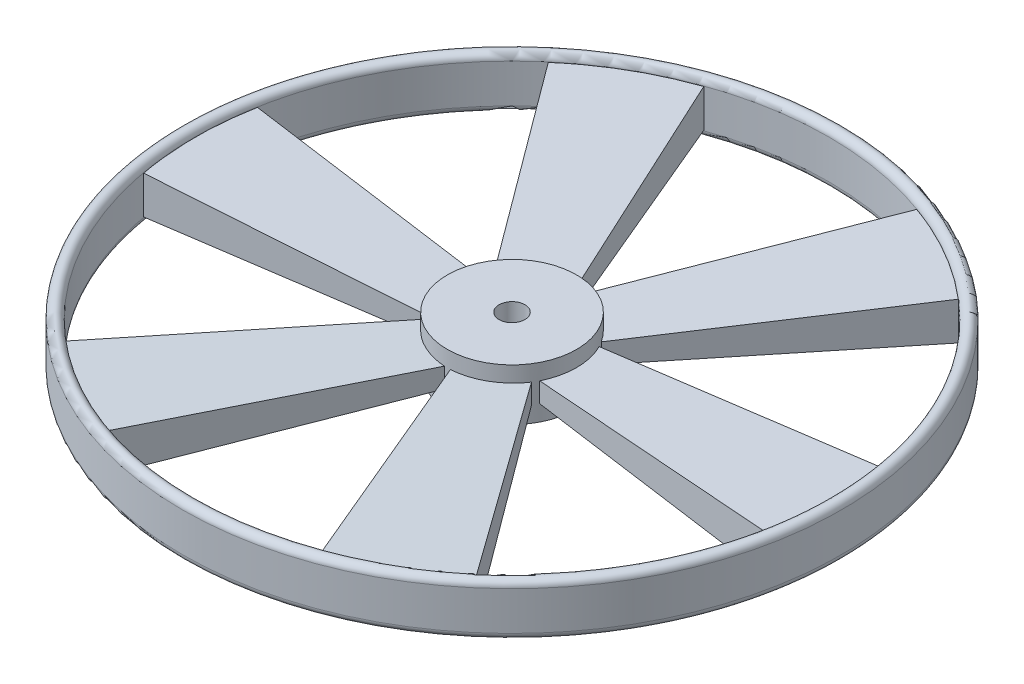
ISO-10303-21;
HEADER;
FILE_DESCRIPTION(('STEP AP214'),'2;1');
FILE_NAME('part.step','',(''),(''),'','','');
FILE_SCHEMA(('AUTOMOTIVE_DESIGN { 1 0 10303 214 1 1 1 1 }'));
ENDSEC;
DATA;
#1=APPLICATION_CONTEXT('core data for automotive mechanical design processes');
#2=APPLICATION_PROTOCOL_DEFINITION('international standard','automotive_design',2000,#1);
#3=PRODUCT_CONTEXT('',#1,'mechanical');
#4=PRODUCT('Part','Part','',(#3));
#5=PRODUCT_RELATED_PRODUCT_CATEGORY('part','',(#4));
#6=PRODUCT_DEFINITION_FORMATION('','',#4);
#7=PRODUCT_DEFINITION_CONTEXT('part definition',#1,'design');
#8=PRODUCT_DEFINITION('design','',#6,#7);
#9=PRODUCT_DEFINITION_SHAPE('','',#8);
#10=(LENGTH_UNIT() NAMED_UNIT(*) SI_UNIT(.MILLI.,.METRE.));
#11=(NAMED_UNIT(*) PLANE_ANGLE_UNIT() SI_UNIT($,.RADIAN.));
#12=(NAMED_UNIT(*) SI_UNIT($,.STERADIAN.) SOLID_ANGLE_UNIT());
#13=UNCERTAINTY_MEASURE_WITH_UNIT(LENGTH_MEASURE(1.E-05),#10,'distance_accuracy_value','');
#14=(GEOMETRIC_REPRESENTATION_CONTEXT(3) GLOBAL_UNCERTAINTY_ASSIGNED_CONTEXT((#13)) GLOBAL_UNIT_ASSIGNED_CONTEXT((#10,
#11,#12)) REPRESENTATION_CONTEXT('',''));
#15=CARTESIAN_POINT('',(0.,0.,0.));
#16=DIRECTION('',(0.,0.,1.));
#17=DIRECTION('',(1.,0.,0.));
#18=AXIS2_PLACEMENT_3D('',#15,#16,#17);
#19=CARTESIAN_POINT('',(-0.192938209331652,0.,-1.80075662042875));
#20=DIRECTION('',(-0.106533123634265,0.,-0.994309153919809));
#21=DIRECTION('',(-0.994309153919809,0.,0.106533123634265));
#22=AXIS2_PLACEMENT_3D('',#19,#20,#21);
#23=PLANE('',#22);
#24=DIRECTION('',(-0.993682817382746,0.0354886720493838,0.106466016148151));
#25=VECTOR('',#24,1.);
#26=CARTESIAN_POINT('',(25.,-1.5,-4.5));
#27=LINE('',#26,#25);
#28=CARTESIAN_POINT('',(24.1009880770596,-1.46789243132355,-4.40367729397067));
#29=VERTEX_POINT('',#28);
#30=CARTESIAN_POINT('',(4.44101722131291,-0.765750615046889,-2.29725184514067));
#31=VERTEX_POINT('',#30);
#32=EDGE_CURVE('E411',#29,#31,#27,.T.);
#33=ORIENTED_EDGE('',*,*,#32,.T.);
#34=DIRECTION('',(0.,-1.,0.));
#35=VECTOR('',#34,1.);
#36=CARTESIAN_POINT('',(4.4410172213129,2.,-2.29725184514067));
#37=LINE('',#36,#35);
#38=CARTESIAN_POINT('',(4.4410172213129,0.76575061504689,-2.29725184514067));
#39=VERTEX_POINT('',#38);
#40=EDGE_CURVE('E408',#31,#39,#37,.F.);
#41=ORIENTED_EDGE('',*,*,#40,.T.);
#42=DIRECTION('',(-0.993682817382746,-0.0354886720493838,0.106466016148151));
#43=VECTOR('',#42,1.);
#44=CARTESIAN_POINT('',(25.,1.5,-4.5));
#45=LINE('',#44,#43);
#46=CARTESIAN_POINT('',(24.1009880770596,1.46789243132356,-4.40367729397067));
#47=VERTEX_POINT('',#46);
#48=EDGE_CURVE('E422',#47,#39,#45,.T.);
#49=ORIENTED_EDGE('',*,*,#48,.F.);
#50=DIRECTION('',(0.,1.,0.));
#51=VECTOR('',#50,1.);
#52=CARTESIAN_POINT('',(24.1009880770596,4.25824122942189,-4.40367729397067));
#53=LINE('',#52,#51);
#54=EDGE_CURVE('E451',#29,#47,#53,.T.);
#55=ORIENTED_EDGE('',*,*,#54,.F.);
#56=EDGE_LOOP('',(#33,#41,#49,#55));
#57=FACE_BOUND('',#56,.T.);
#58=ADVANCED_FACE('F88',(#57),#23,.T.);
#59=CARTESIAN_POINT('',(-0.192938209331652,0.,1.80075662042875));
#60=DIRECTION('',(-0.106533123634265,0.,0.994309153919809));
#61=DIRECTION('',(0.994309153919809,0.,0.106533123634265));
#62=AXIS2_PLACEMENT_3D('',#59,#60,#61);
#63=PLANE('',#62);
#64=DIRECTION('',(-0.993682817382747,-0.0354886720493838,-0.106466016148151));
#65=VECTOR('',#64,1.);
#66=CARTESIAN_POINT('',(25.,1.5,4.5));
#67=LINE('',#66,#65);
#68=CARTESIAN_POINT('',(24.1009880770596,1.46789243132356,4.40367729397067));
#69=VERTEX_POINT('',#68);
#70=CARTESIAN_POINT('',(4.4410172213129,0.765750615046889,2.29725184514067));
#71=VERTEX_POINT('',#70);
#72=EDGE_CURVE('E421',#69,#71,#67,.T.);
#73=ORIENTED_EDGE('',*,*,#72,.T.);
#74=DIRECTION('',(0.,-1.,0.));
#75=VECTOR('',#74,1.);
#76=CARTESIAN_POINT('',(4.4410172213129,2.,2.29725184514067));
#77=LINE('',#76,#75);
#78=CARTESIAN_POINT('',(4.4410172213129,-0.76575061504689,2.29725184514067));
#79=VERTEX_POINT('',#78);
#80=EDGE_CURVE('E454',#71,#79,#77,.T.);
#81=ORIENTED_EDGE('',*,*,#80,.T.);
#82=DIRECTION('',(-0.993682817382747,0.0354886720493838,-0.106466016148151));
#83=VECTOR('',#82,1.);
#84=CARTESIAN_POINT('',(25.,-1.5,4.5));
#85=LINE('',#84,#83);
#86=CARTESIAN_POINT('',(24.1009880770596,-1.46789243132356,4.40367729397067));
#87=VERTEX_POINT('',#86);
#88=EDGE_CURVE('E417',#87,#79,#85,.T.);
#89=ORIENTED_EDGE('',*,*,#88,.F.);
#90=DIRECTION('',(0.,1.,0.));
#91=VECTOR('',#90,1.);
#92=CARTESIAN_POINT('',(24.1009880770596,4.25824122942189,4.40367729397067));
#93=LINE('',#92,#91);
#94=EDGE_CURVE('E442',#69,#87,#93,.F.);
#95=ORIENTED_EDGE('',*,*,#94,.F.);
#96=EDGE_LOOP('',(#73,#81,#89,#95));
#97=FACE_BOUND('',#96,.T.);
#98=ADVANCED_FACE('F562',(#97),#63,.T.);
#99=CARTESIAN_POINT('',(0.,1.5,0.));
#100=DIRECTION('',(0.,1.,0.));
#101=DIRECTION('',(0.,0.,1.));
#102=AXIS2_PLACEMENT_3D('',#99,#100,#101);
#103=TOROIDAL_SURFACE('',#102,25.,0.5);
#104=CARTESIAN_POINT('',(0.,1.5,0.));
#105=DIRECTION('',(0.,1.,0.));
#106=DIRECTION('',(0.,0.,1.));
#107=AXIS2_PLACEMENT_3D('',#104,#105,#106);
#108=CIRCLE('',#107,24.5);
#109=CARTESIAN_POINT('',(0.,1.5,24.5));
#110=VERTEX_POINT('',#109);
#111=EDGE_CURVE('E439',#110,#110,#108,.T.);
#112=ORIENTED_EDGE('',*,*,#111,.F.);
#113=EDGE_LOOP('',(#112));
#114=FACE_BOUND('',#113,.T.);
#115=CARTESIAN_POINT('',(0.,1.5,0.));
#116=DIRECTION('',(0.,1.,0.));
#117=DIRECTION('',(0.,0.,1.));
#118=AXIS2_PLACEMENT_3D('',#115,#116,#117);
#119=CIRCLE('',#118,25.5);
#120=CARTESIAN_POINT('',(0.,1.5,25.5));
#121=VERTEX_POINT('',#120);
#122=EDGE_CURVE('E428',#121,#121,#119,.T.);
#123=ORIENTED_EDGE('',*,*,#122,.T.);
#124=EDGE_LOOP('',(#123));
#125=FACE_BOUND('',#124,.T.);
#126=ADVANCED_FACE('F90',(#114,#125),#103,.T.);
#127=CARTESIAN_POINT('',(0.,4.25824122942189,0.));
#128=DIRECTION('',(0.,1.,0.));
#129=DIRECTION('',(0.,0.,1.));
#130=AXIS2_PLACEMENT_3D('',#127,#128,#129);
#131=CYLINDRICAL_SURFACE('',#130,24.5);
#132=CARTESIAN_POINT('',(0.,-0.607142857142858,0.));
#133=DIRECTION('',(-0.0178457652562065,-0.99936285434755,-0.0309097721236965));
#134=DIRECTION('',(-0.499681427173782,0.0356915305124125,-0.865473619463502));
#135=AXIS2_PLACEMENT_3D('',#132,#133,#134);
#136=ELLIPSE('',#135,24.5156200207133,24.5);
#137=CARTESIAN_POINT('',(8.23679763188274,-1.46789243132356,23.0739065780247));
#138=VERTEX_POINT('',#137);
#139=CARTESIAN_POINT('',(15.8641904451773,-1.46789243132355,18.6702292840539));
#140=VERTEX_POINT('',#139);
#141=EDGE_CURVE('E251',#138,#140,#136,.F.);
#142=ORIENTED_EDGE('',*,*,#141,.T.);
#143=DIRECTION('',(0.,1.,0.));
#144=VECTOR('',#143,1.);
#145=CARTESIAN_POINT('',(15.8641904451773,4.25824122942189,18.6702292840539));
#146=LINE('',#145,#144);
#147=CARTESIAN_POINT('',(15.8641904451773,1.46789243132356,18.6702292840539));
#148=VERTEX_POINT('',#147);
#149=EDGE_CURVE('E264',#140,#148,#146,.T.);
#150=ORIENTED_EDGE('',*,*,#149,.T.);
#151=CARTESIAN_POINT('',(0.,0.607142857142857,0.));
#152=DIRECTION('',(-0.0178457652562067,0.99936285434755,-0.0309097721236964));
#153=DIRECTION('',(0.499681427173788,0.0356915305124125,0.865473619463498));
#154=AXIS2_PLACEMENT_3D('',#151,#152,#153);
#155=ELLIPSE('',#154,24.5156200207133,24.5);
#156=CARTESIAN_POINT('',(8.23679763188274,1.46789243132356,23.0739065780247));
#157=VERTEX_POINT('',#156);
#158=EDGE_CURVE('E256',#148,#157,#155,.F.);
#159=ORIENTED_EDGE('',*,*,#158,.T.);
#160=DIRECTION('',(0.,1.,0.));
#161=VECTOR('',#160,1.);
#162=CARTESIAN_POINT('',(8.23679763188274,4.25824122942189,23.0739065780247));
#163=LINE('',#162,#161);
#164=EDGE_CURVE('E246',#157,#138,#163,.F.);
#165=ORIENTED_EDGE('',*,*,#164,.T.);
#166=EDGE_LOOP('',(#142,#150,#159,#165));
#167=FACE_BOUND('',#166,.T.);
#168=CARTESIAN_POINT('',(0.,-0.607142857142858,0.));
#169=DIRECTION('',(0.0178457652562061,-0.99936285434755,-0.0309097721236967));
#170=DIRECTION('',(0.49968142717377,0.0356915305124125,-0.865473619463508));
#171=AXIS2_PLACEMENT_3D('',#168,#169,#170);
#172=ELLIPSE('',#171,24.5156200207133,24.5);
#173=CARTESIAN_POINT('',(-15.8641904451769,-1.46789243132356,18.6702292840543));
#174=VERTEX_POINT('',#173);
#175=CARTESIAN_POINT('',(-8.23679763188226,-1.46789243132355,23.0739065780249));
#176=VERTEX_POINT('',#175);
#177=EDGE_CURVE('E288',#174,#176,#172,.F.);
#178=ORIENTED_EDGE('',*,*,#177,.T.);
#179=DIRECTION('',(0.,1.,0.));
#180=VECTOR('',#179,1.);
#181=CARTESIAN_POINT('',(-8.23679763188226,4.25824122942189,23.0739065780249));
#182=LINE('',#181,#180);
#183=CARTESIAN_POINT('',(-8.23679763188226,1.46789243132356,23.0739065780249));
#184=VERTEX_POINT('',#183);
#185=EDGE_CURVE('E300',#176,#184,#182,.T.);
#186=ORIENTED_EDGE('',*,*,#185,.T.);
#187=CARTESIAN_POINT('',(0.,0.607142857142857,0.));
#188=DIRECTION('',(0.0178457652562058,0.99936285434755,-0.0309097721236969));
#189=DIRECTION('',(-0.499681427173763,0.0356915305124125,0.865473619463512));
#190=AXIS2_PLACEMENT_3D('',#187,#188,#189);
#191=ELLIPSE('',#190,24.5156200207133,24.5);
#192=CARTESIAN_POINT('',(-15.8641904451769,1.46789243132356,18.6702292840543));
#193=VERTEX_POINT('',#192);
#194=EDGE_CURVE('E293',#184,#193,#191,.F.);
#195=ORIENTED_EDGE('',*,*,#194,.T.);
#196=DIRECTION('',(0.,1.,0.));
#197=VECTOR('',#196,1.);
#198=CARTESIAN_POINT('',(-15.8641904451769,4.25824122942189,18.6702292840543));
#199=LINE('',#198,#197);
#200=EDGE_CURVE('E285',#193,#174,#199,.F.);
#201=ORIENTED_EDGE('',*,*,#200,.T.);
#202=EDGE_LOOP('',(#178,#186,#195,#201));
#203=FACE_BOUND('',#202,.T.);
#204=CARTESIAN_POINT('',(0.,-0.607142857142858,0.));
#205=DIRECTION('',(0.0356915305124125,-0.99936285434755,0.));
#206=DIRECTION('',(0.99936285434755,0.0356915305124125,0.));
#207=AXIS2_PLACEMENT_3D('',#204,#205,#206);
#208=ELLIPSE('',#207,24.5156200207133,24.5);
#209=CARTESIAN_POINT('',(-24.1009880770596,-1.46789243132356,-4.40367729397067));
#210=VERTEX_POINT('',#209);
#211=CARTESIAN_POINT('',(-24.1009880770596,-1.46789243132355,4.40367729397067));
#212=VERTEX_POINT('',#211);
#213=EDGE_CURVE('E319',#210,#212,#208,.F.);
#214=ORIENTED_EDGE('',*,*,#213,.T.);
#215=DIRECTION('',(0.,1.,0.));
#216=VECTOR('',#215,1.);
#217=CARTESIAN_POINT('',(-24.1009880770596,4.25824122942189,4.40367729397067));
#218=LINE('',#217,#216);
#219=CARTESIAN_POINT('',(-24.1009880770596,1.46789243132356,4.40367729397067));
#220=VERTEX_POINT('',#219);
#221=EDGE_CURVE('E331',#212,#220,#218,.T.);
#222=ORIENTED_EDGE('',*,*,#221,.T.);
#223=CARTESIAN_POINT('',(0.,0.607142857142857,0.));
#224=DIRECTION('',(0.0356915305124125,0.99936285434755,0.));
#225=DIRECTION('',(-0.99936285434755,0.0356915305124125,0.));
#226=AXIS2_PLACEMENT_3D('',#223,#224,#225);
#227=ELLIPSE('',#226,24.5156200207133,24.5);
#228=CARTESIAN_POINT('',(-24.1009880770596,1.46789243132356,-4.40367729397067));
#229=VERTEX_POINT('',#228);
#230=EDGE_CURVE('E324',#220,#229,#227,.F.);
#231=ORIENTED_EDGE('',*,*,#230,.T.);
#232=DIRECTION('',(0.,1.,0.));
#233=VECTOR('',#232,1.);
#234=CARTESIAN_POINT('',(-24.1009880770596,4.25824122942189,-4.40367729397067));
#235=LINE('',#234,#233);
#236=EDGE_CURVE('E316',#229,#210,#235,.F.);
#237=ORIENTED_EDGE('',*,*,#236,.T.);
#238=EDGE_LOOP('',(#214,#222,#231,#237));
#239=FACE_BOUND('',#238,.T.);
#240=CARTESIAN_POINT('',(0.,-0.607142857142858,0.));
#241=DIRECTION('',(0.0178457652562063,-0.99936285434755,0.0309097721236966));
#242=DIRECTION('',(0.499681427173775,0.0356915305124125,0.865473619463506));
#243=AXIS2_PLACEMENT_3D('',#240,#241,#242);
#244=ELLIPSE('',#243,24.5156200207133,24.5);
#245=CARTESIAN_POINT('',(-8.23679763188258,-1.46789243132356,-23.0739065780248));
#246=VERTEX_POINT('',#245);
#247=CARTESIAN_POINT('',(-15.8641904451772,-1.46789243132355,-18.670229284054));
#248=VERTEX_POINT('',#247);
#249=EDGE_CURVE('E350',#246,#248,#244,.F.);
#250=ORIENTED_EDGE('',*,*,#249,.T.);
#251=DIRECTION('',(0.,1.,0.));
#252=VECTOR('',#251,1.);
#253=CARTESIAN_POINT('',(-15.8641904451772,4.25824122942189,-18.670229284054));
#254=LINE('',#253,#252);
#255=CARTESIAN_POINT('',(-15.8641904451772,1.46789243132356,-18.670229284054));
#256=VERTEX_POINT('',#255);
#257=EDGE_CURVE('E362',#248,#256,#254,.T.);
#258=ORIENTED_EDGE('',*,*,#257,.T.);
#259=CARTESIAN_POINT('',(0.,0.607142857142857,0.));
#260=DIRECTION('',(0.0178457652562065,0.99936285434755,0.0309097721236965));
#261=DIRECTION('',(-0.499681427173782,0.0356915305124125,-0.865473619463502));
#262=AXIS2_PLACEMENT_3D('',#259,#260,#261);
#263=ELLIPSE('',#262,24.5156200207133,24.5);
#264=CARTESIAN_POINT('',(-8.23679763188258,1.46789243132356,-23.0739065780248));
#265=VERTEX_POINT('',#264);
#266=EDGE_CURVE('E355',#256,#265,#263,.F.);
#267=ORIENTED_EDGE('',*,*,#266,.T.);
#268=DIRECTION('',(0.,1.,0.));
#269=VECTOR('',#268,1.);
#270=CARTESIAN_POINT('',(-8.23679763188258,4.25824122942189,-23.0739065780248));
#271=LINE('',#270,#269);
#272=EDGE_CURVE('E347',#265,#246,#271,.F.);
#273=ORIENTED_EDGE('',*,*,#272,.T.);
#274=EDGE_LOOP('',(#250,#258,#267,#273));
#275=FACE_BOUND('',#274,.T.);
#276=CARTESIAN_POINT('',(0.,-0.607142857142858,0.));
#277=DIRECTION('',(-0.0178457652562063,-0.99936285434755,0.0309097721236966));
#278=DIRECTION('',(-0.499681427173776,0.0356915305124125,0.865473619463505));
#279=AXIS2_PLACEMENT_3D('',#276,#277,#278);
#280=ELLIPSE('',#279,24.5156200207133,24.5);
#281=CARTESIAN_POINT('',(15.864190445177,-1.46789243132356,-18.6702292840542));
#282=VERTEX_POINT('',#281);
#283=CARTESIAN_POINT('',(8.23679763188242,-1.46789243132355,-23.0739065780248));
#284=VERTEX_POINT('',#283);
#285=EDGE_CURVE('E381',#282,#284,#280,.F.);
#286=ORIENTED_EDGE('',*,*,#285,.T.);
#287=DIRECTION('',(0.,1.,0.));
#288=VECTOR('',#287,1.);
#289=CARTESIAN_POINT('',(8.23679763188242,4.25824122942189,-23.0739065780248));
#290=LINE('',#289,#288);
#291=CARTESIAN_POINT('',(8.23679763188242,1.46789243132356,-23.0739065780248));
#292=VERTEX_POINT('',#291);
#293=EDGE_CURVE('E393',#284,#292,#290,.T.);
#294=ORIENTED_EDGE('',*,*,#293,.T.);
#295=CARTESIAN_POINT('',(0.,0.607142857142857,0.));
#296=DIRECTION('',(-0.0178457652562061,0.99936285434755,0.0309097721236968));
#297=DIRECTION('',(0.499681427173769,0.0356915305124125,-0.865473619463509));
#298=AXIS2_PLACEMENT_3D('',#295,#296,#297);
#299=ELLIPSE('',#298,24.5156200207133,24.5);
#300=CARTESIAN_POINT('',(15.864190445177,1.46789243132356,-18.6702292840542));
#301=VERTEX_POINT('',#300);
#302=EDGE_CURVE('E386',#292,#301,#299,.F.);
#303=ORIENTED_EDGE('',*,*,#302,.T.);
#304=DIRECTION('',(0.,1.,0.));
#305=VECTOR('',#304,1.);
#306=CARTESIAN_POINT('',(15.8641904451771,4.25824122942189,-18.6702292840542));
#307=LINE('',#306,#305);
#308=EDGE_CURVE('E378',#301,#282,#307,.F.);
#309=ORIENTED_EDGE('',*,*,#308,.T.);
#310=EDGE_LOOP('',(#286,#294,#303,#309));
#311=FACE_BOUND('',#310,.T.);
#312=CARTESIAN_POINT('',(0.,-0.607142857142858,0.));
#313=DIRECTION('',(-0.0356915305124125,-0.99936285434755,0.));
#314=DIRECTION('',(-0.99936285434755,0.0356915305124125,0.));
#315=AXIS2_PLACEMENT_3D('',#312,#313,#314);
#316=ELLIPSE('',#315,24.5156200207133,24.5);
#317=EDGE_CURVE('E445',#87,#29,#316,.F.);
#318=ORIENTED_EDGE('',*,*,#317,.T.);
#319=ORIENTED_EDGE('',*,*,#54,.T.);
#320=CARTESIAN_POINT('',(0.,0.607142857142857,0.));
#321=DIRECTION('',(-0.0356915305124125,0.99936285434755,0.));
#322=DIRECTION('',(0.99936285434755,0.0356915305124125,0.));
#323=AXIS2_PLACEMENT_3D('',#320,#321,#322);
#324=ELLIPSE('',#323,24.5156200207133,24.5);
#325=EDGE_CURVE('E448',#47,#69,#324,.F.);
#326=ORIENTED_EDGE('',*,*,#325,.T.);
#327=ORIENTED_EDGE('',*,*,#94,.T.);
#328=EDGE_LOOP('',(#318,#319,#326,#327));
#329=FACE_BOUND('',#328,.T.);
#330=CARTESIAN_POINT('',(0.,-1.5,0.));
#331=DIRECTION('',(0.,1.,0.));
#332=DIRECTION('',(0.,0.,1.));
#333=AXIS2_PLACEMENT_3D('',#330,#331,#332);
#334=CIRCLE('',#333,24.5);
#335=CARTESIAN_POINT('',(0.,-1.5,24.5));
#336=VERTEX_POINT('',#335);
#337=EDGE_CURVE('E436',#336,#336,#334,.T.);
#338=ORIENTED_EDGE('',*,*,#337,.F.);
#339=EDGE_LOOP('',(#338));
#340=FACE_BOUND('',#339,.T.);
#341=ORIENTED_EDGE('',*,*,#111,.T.);
#342=EDGE_LOOP('',(#341));
#343=FACE_BOUND('',#342,.T.);
#344=ADVANCED_FACE('F262',(#167,#203,#239,#275,#311,#329,#340,#343),#131,.F.);
#345=CARTESIAN_POINT('',(0.,-1.5,0.));
#346=DIRECTION('',(0.,1.,0.));
#347=DIRECTION('',(0.,0.,1.));
#348=AXIS2_PLACEMENT_3D('',#345,#346,#347);
#349=TOROIDAL_SURFACE('',#348,25.,0.5);
#350=CARTESIAN_POINT('',(0.,-1.5,0.));
#351=DIRECTION('',(0.,1.,0.));
#352=DIRECTION('',(0.,0.,1.));
#353=AXIS2_PLACEMENT_3D('',#350,#351,#352);
#354=CIRCLE('',#353,25.5);
#355=CARTESIAN_POINT('',(0.,-1.5,25.5));
#356=VERTEX_POINT('',#355);
#357=EDGE_CURVE('E433',#356,#356,#354,.T.);
#358=ORIENTED_EDGE('',*,*,#357,.F.);
#359=EDGE_LOOP('',(#358));
#360=FACE_BOUND('',#359,.T.);
#361=ORIENTED_EDGE('',*,*,#337,.T.);
#362=EDGE_LOOP('',(#361));
#363=FACE_BOUND('',#362,.T.);
#364=ADVANCED_FACE('F581',(#360,#363),#349,.T.);
#365=CARTESIAN_POINT('',(0.,4.25824122942189,0.));
#366=DIRECTION('',(0.,1.,0.));
#367=DIRECTION('',(0.,0.,1.));
#368=AXIS2_PLACEMENT_3D('',#365,#366,#367);
#369=CYLINDRICAL_SURFACE('',#368,25.5);
#370=ORIENTED_EDGE('',*,*,#122,.F.);
#371=EDGE_LOOP('',(#370));
#372=FACE_BOUND('',#371,.T.);
#373=ORIENTED_EDGE('',*,*,#357,.T.);
#374=EDGE_LOOP('',(#373));
#375=FACE_BOUND('',#374,.T.);
#376=ADVANCED_FACE('F574',(#372,#375),#369,.T.);
#377=CARTESIAN_POINT('',(-0.021656050955414,0.606369426751592,0.));
#378=DIRECTION('',(-0.0356915305124125,0.99936285434755,0.));
#379=DIRECTION('',(-0.99936285434755,-0.0356915305124125,0.));
#380=AXIS2_PLACEMENT_3D('',#377,#378,#379);
#381=PLANE('',#380);
#382=ORIENTED_EDGE('',*,*,#48,.T.);
#383=CARTESIAN_POINT('',(0.,0.607142857142857,0.));
#384=DIRECTION('',(-0.0356915305124125,0.99936285434755,0.));
#385=DIRECTION('',(-0.99936285434755,-0.0356915305124125,0.));
#386=AXIS2_PLACEMENT_3D('',#383,#384,#385);
#387=ELLIPSE('',#386,5.00318775932925,5.);
#388=EDGE_CURVE('E405',#39,#71,#387,.F.);
#389=ORIENTED_EDGE('',*,*,#388,.T.);
#390=ORIENTED_EDGE('',*,*,#72,.F.);
#391=ORIENTED_EDGE('',*,*,#325,.F.);
#392=EDGE_LOOP('',(#382,#389,#390,#391));
#393=FACE_BOUND('',#392,.T.);
#394=ADVANCED_FACE('F571',(#393),#381,.T.);
#395=CARTESIAN_POINT('',(-0.021656050955414,-0.606369426751593,0.));
#396=DIRECTION('',(-0.0356915305124125,-0.99936285434755,0.));
#397=DIRECTION('',(0.99936285434755,-0.0356915305124125,0.));
#398=AXIS2_PLACEMENT_3D('',#395,#396,#397);
#399=PLANE('',#398);
#400=ORIENTED_EDGE('',*,*,#88,.T.);
#401=CARTESIAN_POINT('',(0.,-0.607142857142858,0.));
#402=DIRECTION('',(-0.0356915305124125,-0.99936285434755,0.));
#403=DIRECTION('',(0.99936285434755,-0.0356915305124125,0.));
#404=AXIS2_PLACEMENT_3D('',#401,#402,#403);
#405=ELLIPSE('',#404,5.00318775932925,5.);
#406=EDGE_CURVE('E402',#79,#31,#405,.F.);
#407=ORIENTED_EDGE('',*,*,#406,.T.);
#408=ORIENTED_EDGE('',*,*,#32,.F.);
#409=ORIENTED_EDGE('',*,*,#317,.F.);
#410=EDGE_LOOP('',(#400,#407,#408,#409));
#411=FACE_BOUND('',#410,.T.);
#412=ADVANCED_FACE('F547',(#411),#399,.T.);
#413=CARTESIAN_POINT('',(0.,2.,0.));
#414=DIRECTION('',(0.,-1.,0.));
#415=DIRECTION('',(0.,0.,-1.));
#416=AXIS2_PLACEMENT_3D('',#413,#414,#415);
#417=CYLINDRICAL_SURFACE('',#416,5.);
#418=CARTESIAN_POINT('',(0.,0.607142857142857,0.));
#419=DIRECTION('',(-0.0178457652562067,0.99936285434755,-0.0309097721236964));
#420=DIRECTION('',(-0.499681427173788,-0.0356915305124125,-0.865473619463498));
#421=AXIS2_PLACEMENT_3D('',#418,#419,#420);
#422=ELLIPSE('',#421,5.00318775932925,5.);
#423=CARTESIAN_POINT('',(0.231030153874016,0.765750615046889,4.99465965487149));
#424=VERTEX_POINT('',#423);
#425=CARTESIAN_POINT('',(4.20998706743898,0.76575061504689,2.69740780973077));
#426=VERTEX_POINT('',#425);
#427=EDGE_CURVE('E96',#424,#426,#422,.T.);
#428=ORIENTED_EDGE('',*,*,#427,.T.);
#429=DIRECTION('',(0.,-1.,0.));
#430=VECTOR('',#429,1.);
#431=CARTESIAN_POINT('',(4.20998706743898,2.,2.69740780973077));
#432=LINE('',#431,#430);
#433=CARTESIAN_POINT('',(4.20998706743899,-0.76575061504689,2.69740780973078));
#434=VERTEX_POINT('',#433);
#435=EDGE_CURVE('E12',#426,#434,#432,.T.);
#436=ORIENTED_EDGE('',*,*,#435,.T.);
#437=CARTESIAN_POINT('',(0.,-0.607142857142857,0.));
#438=DIRECTION('',(-0.0178457652562065,-0.99936285434755,-0.0309097721236965));
#439=DIRECTION('',(0.499681427173782,-0.0356915305124125,0.865473619463502));
#440=AXIS2_PLACEMENT_3D('',#437,#438,#439);
#441=ELLIPSE('',#440,5.00318775932925,5.);
#442=CARTESIAN_POINT('',(0.231030153874016,-0.76575061504689,4.99465965487149));
#443=VERTEX_POINT('',#442);
#444=EDGE_CURVE('E507',#434,#443,#441,.T.);
#445=ORIENTED_EDGE('',*,*,#444,.T.);
#446=DIRECTION('',(0.,-1.,0.));
#447=VECTOR('',#446,1.);
#448=CARTESIAN_POINT('',(0.231030153874016,2.,4.99465965487149));
#449=LINE('',#448,#447);
#450=EDGE_CURVE('E505',#443,#424,#449,.F.);
#451=ORIENTED_EDGE('',*,*,#450,.T.);
#452=EDGE_LOOP('',(#428,#436,#445,#451));
#453=FACE_BOUND('',#452,.T.);
#454=CARTESIAN_POINT('',(0.,0.607142857142858,0.));
#455=DIRECTION('',(0.0178457652562058,0.99936285434755,-0.0309097721236969));
#456=DIRECTION('',(0.499681427173763,-0.0356915305124125,-0.865473619463512));
#457=AXIS2_PLACEMENT_3D('',#454,#455,#456);
#458=ELLIPSE('',#457,5.00318775932925,5.);
#459=CARTESIAN_POINT('',(-4.20998706743892,0.765750615046889,2.69740780973086));
#460=VERTEX_POINT('',#459);
#461=CARTESIAN_POINT('',(-0.231030153873915,0.76575061504689,4.9946596548715));
#462=VERTEX_POINT('',#461);
#463=EDGE_CURVE('E499',#460,#462,#458,.T.);
#464=ORIENTED_EDGE('',*,*,#463,.T.);
#465=DIRECTION('',(0.,-1.,0.));
#466=VECTOR('',#465,1.);
#467=CARTESIAN_POINT('',(-0.231030153873913,2.,4.99465965487149));
#468=LINE('',#467,#466);
#469=CARTESIAN_POINT('',(-0.231030153873919,-0.76575061504689,4.99465965487151));
#470=VERTEX_POINT('',#469);
#471=EDGE_CURVE('E502',#462,#470,#468,.T.);
#472=ORIENTED_EDGE('',*,*,#471,.T.);
#473=CARTESIAN_POINT('',(0.,-0.607142857142857,0.));
#474=DIRECTION('',(0.0178457652562061,-0.99936285434755,-0.0309097721236967));
#475=DIRECTION('',(-0.49968142717377,-0.0356915305124125,0.865473619463508));
#476=AXIS2_PLACEMENT_3D('',#473,#474,#475);
#477=ELLIPSE('',#476,5.00318775932925,5.);
#478=CARTESIAN_POINT('',(-4.20998706743892,-0.76575061504689,2.69740780973086));
#479=VERTEX_POINT('',#478);
#480=EDGE_CURVE('E496',#470,#479,#477,.T.);
#481=ORIENTED_EDGE('',*,*,#480,.T.);
#482=DIRECTION('',(0.,-1.,0.));
#483=VECTOR('',#482,1.);
#484=CARTESIAN_POINT('',(-4.20998706743892,2.,2.69740780973086));
#485=LINE('',#484,#483);
#486=EDGE_CURVE('E493',#479,#460,#485,.F.);
#487=ORIENTED_EDGE('',*,*,#486,.T.);
#488=EDGE_LOOP('',(#464,#472,#481,#487));
#489=FACE_BOUND('',#488,.T.);
#490=CARTESIAN_POINT('',(0.,0.607142857142857,0.));
#491=DIRECTION('',(0.0356915305124125,0.99936285434755,0.));
#492=DIRECTION('',(0.99936285434755,-0.0356915305124125,0.));
#493=AXIS2_PLACEMENT_3D('',#490,#491,#492);
#494=ELLIPSE('',#493,5.00318775932925,5.);
#495=CARTESIAN_POINT('',(-4.4410172213129,0.765750615046889,-2.29725184514067));
#496=VERTEX_POINT('',#495);
#497=CARTESIAN_POINT('',(-4.4410172213129,0.76575061504689,2.29725184514067));
#498=VERTEX_POINT('',#497);
#499=EDGE_CURVE('E487',#496,#498,#494,.T.);
#500=ORIENTED_EDGE('',*,*,#499,.T.);
#501=DIRECTION('',(0.,-1.,0.));
#502=VECTOR('',#501,1.);
#503=CARTESIAN_POINT('',(-4.4410172213129,2.,2.29725184514067));
#504=LINE('',#503,#502);
#505=CARTESIAN_POINT('',(-4.44101722131291,-0.765750615046889,2.29725184514067));
#506=VERTEX_POINT('',#505);
#507=EDGE_CURVE('E490',#498,#506,#504,.T.);
#508=ORIENTED_EDGE('',*,*,#507,.T.);
#509=CARTESIAN_POINT('',(0.,-0.607142857142858,0.));
#510=DIRECTION('',(0.0356915305124125,-0.99936285434755,0.));
#511=DIRECTION('',(-0.99936285434755,-0.0356915305124125,0.));
#512=AXIS2_PLACEMENT_3D('',#509,#510,#511);
#513=ELLIPSE('',#512,5.00318775932925,5.);
#514=CARTESIAN_POINT('',(-4.4410172213129,-0.76575061504689,-2.29725184514067));
#515=VERTEX_POINT('',#514);
#516=EDGE_CURVE('E484',#506,#515,#513,.T.);
#517=ORIENTED_EDGE('',*,*,#516,.T.);
#518=DIRECTION('',(0.,-1.,0.));
#519=VECTOR('',#518,1.);
#520=CARTESIAN_POINT('',(-4.4410172213129,2.,-2.29725184514067));
#521=LINE('',#520,#519);
#522=EDGE_CURVE('E481',#515,#496,#521,.F.);
#523=ORIENTED_EDGE('',*,*,#522,.T.);
#524=EDGE_LOOP('',(#500,#508,#517,#523));
#525=FACE_BOUND('',#524,.T.);
#526=CARTESIAN_POINT('',(0.,0.607142857142858,0.));
#527=DIRECTION('',(0.0178457652562065,0.99936285434755,0.0309097721236965));
#528=DIRECTION('',(0.499681427173782,-0.0356915305124125,0.865473619463502));
#529=AXIS2_PLACEMENT_3D('',#526,#527,#528);
#530=ELLIPSE('',#529,5.00318775932925,5.);
#531=CARTESIAN_POINT('',(-0.231030153873981,0.765750615046889,-4.99465965487149));
#532=VERTEX_POINT('',#531);
#533=CARTESIAN_POINT('',(-4.20998706743896,0.76575061504689,-2.6974078097308));
#534=VERTEX_POINT('',#533);
#535=EDGE_CURVE('E475',#532,#534,#530,.T.);
#536=ORIENTED_EDGE('',*,*,#535,.T.);
#537=DIRECTION('',(0.,-1.,0.));
#538=VECTOR('',#537,1.);
#539=CARTESIAN_POINT('',(-4.20998706743896,2.,-2.6974078097308));
#540=LINE('',#539,#538);
#541=CARTESIAN_POINT('',(-4.20998706743896,-0.765750615046889,-2.6974078097308));
#542=VERTEX_POINT('',#541);
#543=EDGE_CURVE('E478',#534,#542,#540,.T.);
#544=ORIENTED_EDGE('',*,*,#543,.T.);
#545=CARTESIAN_POINT('',(0.,-0.607142857142857,0.));
#546=DIRECTION('',(0.0178457652562063,-0.99936285434755,0.0309097721236966));
#547=DIRECTION('',(-0.499681427173775,-0.0356915305124125,-0.865473619463506));
#548=AXIS2_PLACEMENT_3D('',#545,#546,#547);
#549=ELLIPSE('',#548,5.00318775932925,5.);
#550=CARTESIAN_POINT('',(-0.231030153873981,-0.76575061504689,-4.99465965487149));
#551=VERTEX_POINT('',#550);
#552=EDGE_CURVE('E472',#542,#551,#549,.T.);
#553=ORIENTED_EDGE('',*,*,#552,.T.);
#554=DIRECTION('',(0.,-1.,0.));
#555=VECTOR('',#554,1.);
#556=CARTESIAN_POINT('',(-0.23103015387398,2.,-4.99465965487149));
#557=LINE('',#556,#555);
#558=EDGE_CURVE('E469',#551,#532,#557,.F.);
#559=ORIENTED_EDGE('',*,*,#558,.T.);
#560=EDGE_LOOP('',(#536,#544,#553,#559));
#561=FACE_BOUND('',#560,.T.);
#562=CARTESIAN_POINT('',(0.,0.607142857142858,0.));
#563=DIRECTION('',(-0.0178457652562061,0.99936285434755,0.0309097721236968));
#564=DIRECTION('',(-0.499681427173769,-0.0356915305124125,0.865473619463509));
#565=AXIS2_PLACEMENT_3D('',#562,#563,#564);
#566=ELLIPSE('',#565,5.00318775932925,5.);
#567=CARTESIAN_POINT('',(4.20998706743894,0.765750615046889,-2.69740780973083));
#568=VERTEX_POINT('',#567);
#569=CARTESIAN_POINT('',(0.23103015387395,0.76575061504689,-4.9946596548715));
#570=VERTEX_POINT('',#569);
#571=EDGE_CURVE('E463',#568,#570,#566,.T.);
#572=ORIENTED_EDGE('',*,*,#571,.T.);
#573=DIRECTION('',(0.,-1.,0.));
#574=VECTOR('',#573,1.);
#575=CARTESIAN_POINT('',(0.231030153873948,2.,-4.99465965487149));
#576=LINE('',#575,#574);
#577=CARTESIAN_POINT('',(0.231030153873954,-0.76575061504689,-4.9946596548715));
#578=VERTEX_POINT('',#577);
#579=EDGE_CURVE('E466',#570,#578,#576,.T.);
#580=ORIENTED_EDGE('',*,*,#579,.T.);
#581=CARTESIAN_POINT('',(0.,-0.607142857142857,0.));
#582=DIRECTION('',(-0.0178457652562063,-0.99936285434755,0.0309097721236966));
#583=DIRECTION('',(0.499681427173776,-0.0356915305124125,-0.865473619463505));
#584=AXIS2_PLACEMENT_3D('',#581,#582,#583);
#585=ELLIPSE('',#584,5.00318775932925,5.);
#586=CARTESIAN_POINT('',(4.20998706743894,-0.76575061504689,-2.69740780973083));
#587=VERTEX_POINT('',#586);
#588=EDGE_CURVE('E460',#578,#587,#585,.T.);
#589=ORIENTED_EDGE('',*,*,#588,.T.);
#590=DIRECTION('',(0.,-1.,0.));
#591=VECTOR('',#590,1.);
#592=CARTESIAN_POINT('',(4.20998706743894,2.,-2.69740780973083));
#593=LINE('',#592,#591);
#594=EDGE_CURVE('E457',#587,#568,#593,.F.);
#595=ORIENTED_EDGE('',*,*,#594,.T.);
#596=EDGE_LOOP('',(#572,#580,#589,#595));
#597=FACE_BOUND('',#596,.T.);
#598=ORIENTED_EDGE('',*,*,#40,.F.);
#599=ORIENTED_EDGE('',*,*,#406,.F.);
#600=ORIENTED_EDGE('',*,*,#80,.F.);
#601=ORIENTED_EDGE('',*,*,#388,.F.);
#602=EDGE_LOOP('',(#598,#599,#600,#601));
#603=FACE_BOUND('',#602,.T.);
#604=CARTESIAN_POINT('',(0.,2.,0.));
#605=DIRECTION('',(0.,1.,0.));
#606=DIRECTION('',(0.,0.,1.));
#607=AXIS2_PLACEMENT_3D('',#604,#605,#606);
#608=CIRCLE('',#607,5.);
#609=CARTESIAN_POINT('',(0.,2.,5.));
#610=VERTEX_POINT('',#609);
#611=EDGE_CURVE('E399',#610,#610,#608,.T.);
#612=ORIENTED_EDGE('',*,*,#611,.F.);
#613=EDGE_LOOP('',(#612));
#614=FACE_BOUND('',#613,.T.);
#615=CARTESIAN_POINT('',(0.,-2.,0.));
#616=DIRECTION('',(0.,1.,0.));
#617=DIRECTION('',(0.,0.,1.));
#618=AXIS2_PLACEMENT_3D('',#615,#616,#617);
#619=CIRCLE('',#618,5.);
#620=CARTESIAN_POINT('',(0.,-2.,5.));
#621=VERTEX_POINT('',#620);
#622=EDGE_CURVE('E396',#621,#621,#619,.T.);
#623=ORIENTED_EDGE('',*,*,#622,.T.);
#624=EDGE_LOOP('',(#623));
#625=FACE_BOUND('',#624,.T.);
#626=ADVANCED_FACE('F510',(#453,#489,#525,#561,#597,#603,#614,#625),#417,.T.);
#627=CARTESIAN_POINT('',(0.,2.,0.));
#628=DIRECTION('',(0.,1.,0.));
#629=DIRECTION('',(0.,0.,1.));
#630=AXIS2_PLACEMENT_3D('',#627,#628,#629);
#631=PLANE('',#630);
#632=CARTESIAN_POINT('',(0.,2.,0.));
#633=DIRECTION('',(0.,1.,0.));
#634=DIRECTION('',(0.,0.,1.));
#635=AXIS2_PLACEMENT_3D('',#632,#633,#634);
#636=CIRCLE('',#635,1.);
#637=CARTESIAN_POINT('',(0.,2.,1.));
#638=VERTEX_POINT('',#637);
#639=EDGE_CURVE('E524',#638,#638,#636,.T.);
#640=ORIENTED_EDGE('',*,*,#639,.F.);
#641=EDGE_LOOP('',(#640));
#642=FACE_BOUND('',#641,.T.);
#643=ORIENTED_EDGE('',*,*,#611,.T.);
#644=EDGE_LOOP('',(#643));
#645=FACE_BOUND('',#644,.T.);
#646=ADVANCED_FACE('F538',(#642,#645),#631,.T.);
#647=CARTESIAN_POINT('',(0.,-2.,0.));
#648=DIRECTION('',(0.,1.,0.));
#649=DIRECTION('',(0.,0.,1.));
#650=AXIS2_PLACEMENT_3D('',#647,#648,#649);
#651=PLANE('',#650);
#652=ORIENTED_EDGE('',*,*,#622,.F.);
#653=EDGE_LOOP('',(#652));
#654=FACE_BOUND('',#653,.T.);
#655=ADVANCED_FACE('F541',(#654),#651,.F.);
#656=CARTESIAN_POINT('',(-1.65597008399014,0.,-0.733288919572481));
#657=DIRECTION('',(-0.9143635483271,0.,-0.40489418554812));
#658=DIRECTION('',(-0.40489418554812,0.,0.9143635483271));
#659=AXIS2_PLACEMENT_3D('',#656,#657,#658);
#660=PLANE('',#659);
#661=ORIENTED_EDGE('',*,*,#293,.F.);
#662=DIRECTION('',(-0.404639134067348,0.0354886720493838,0.913787571231628));
#663=VECTOR('',#662,1.);
#664=CARTESIAN_POINT('',(8.60288568296997,-1.5,-23.900635094611));
#665=LINE('',#664,#663);
#666=EDGE_CURVE('E365',#284,#578,#665,.T.);
#667=ORIENTED_EDGE('',*,*,#666,.T.);
#668=ORIENTED_EDGE('',*,*,#579,.F.);
#669=DIRECTION('',(-0.404639134067348,-0.0354886720493838,0.913787571231628));
#670=VECTOR('',#669,1.);
#671=CARTESIAN_POINT('',(8.60288568296997,1.5,-23.900635094611));
#672=LINE('',#671,#670);
#673=EDGE_CURVE('E376',#292,#570,#672,.T.);
#674=ORIENTED_EDGE('',*,*,#673,.F.);
#675=EDGE_LOOP('',(#661,#667,#668,#674));
#676=FACE_BOUND('',#675,.T.);
#677=ADVANCED_FACE('F552',(#676),#660,.T.);
#678=CARTESIAN_POINT('',(1.46303187465849,0.,1.06746770085626));
#679=DIRECTION('',(0.807830424692835,0.,0.589414968371685));
#680=DIRECTION('',(0.589414968371685,0.,-0.807830424692835));
#681=AXIS2_PLACEMENT_3D('',#678,#679,#680);
#682=PLANE('',#681);
#683=ORIENTED_EDGE('',*,*,#308,.F.);
#684=DIRECTION('',(-0.589043683315395,-0.0354886720493838,0.807321555083477));
#685=VECTOR('',#684,1.);
#686=CARTESIAN_POINT('',(16.3971143170299,1.5,-19.400635094611));
#687=LINE('',#686,#685);
#688=EDGE_CURVE('E375',#301,#568,#687,.T.);
#689=ORIENTED_EDGE('',*,*,#688,.T.);
#690=ORIENTED_EDGE('',*,*,#594,.F.);
#691=DIRECTION('',(-0.589043683315395,0.0354886720493838,0.807321555083477));
#692=VECTOR('',#691,1.);
#693=CARTESIAN_POINT('',(16.3971143170299,-1.5,-19.400635094611));
#694=LINE('',#693,#692);
#695=EDGE_CURVE('E371',#282,#587,#694,.T.);
#696=ORIENTED_EDGE('',*,*,#695,.F.);
#697=EDGE_LOOP('',(#683,#689,#690,#696));
#698=FACE_BOUND('',#697,.T.);
#699=ADVANCED_FACE('F557',(#698),#682,.T.);
#700=CARTESIAN_POINT('',(-0.0108280254777069,0.606369426751592,0.0187546902730389));
#701=DIRECTION('',(-0.0178457652562061,0.99936285434755,0.0309097721236968));
#702=DIRECTION('',(-0.499681427173773,-0.0356915305124125,0.865473619463507));
#703=AXIS2_PLACEMENT_3D('',#700,#701,#702);
#704=PLANE('',#703);
#705=ORIENTED_EDGE('',*,*,#302,.F.);
#706=ORIENTED_EDGE('',*,*,#673,.T.);
#707=ORIENTED_EDGE('',*,*,#571,.F.);
#708=ORIENTED_EDGE('',*,*,#688,.F.);
#709=EDGE_LOOP('',(#705,#706,#707,#708));
#710=FACE_BOUND('',#709,.T.);
#711=ADVANCED_FACE('F653',(#710),#704,.T.);
#712=CARTESIAN_POINT('',(-0.010828025477707,-0.606369426751593,0.0187546902730388));
#713=DIRECTION('',(-0.0178457652562063,-0.99936285434755,0.0309097721236966));
#714=DIRECTION('',(0.499681427173773,-0.0356915305124125,-0.865473619463507));
#715=AXIS2_PLACEMENT_3D('',#712,#713,#714);
#716=PLANE('',#715);
#717=ORIENTED_EDGE('',*,*,#285,.F.);
#718=ORIENTED_EDGE('',*,*,#695,.T.);
#719=ORIENTED_EDGE('',*,*,#588,.F.);
#720=ORIENTED_EDGE('',*,*,#666,.F.);
#721=EDGE_LOOP('',(#717,#718,#719,#720));
#722=FACE_BOUND('',#721,.T.);
#723=ADVANCED_FACE('F662',(#722),#716,.T.);
#724=CARTESIAN_POINT('',(-1.46303187465848,0.,1.06746770085627));
#725=DIRECTION('',(-0.807830424692831,0.,0.58941496837169));
#726=DIRECTION('',(0.58941496837169,0.,0.807830424692831));
#727=AXIS2_PLACEMENT_3D('',#724,#725,#726);
#728=PLANE('',#727);
#729=ORIENTED_EDGE('',*,*,#257,.F.);
#730=DIRECTION('',(0.5890436833154,0.0354886720493838,0.807321555083473));
#731=VECTOR('',#730,1.);
#732=CARTESIAN_POINT('',(-16.3971143170301,-1.5,-19.4006350946109));
#733=LINE('',#732,#731);
#734=EDGE_CURVE('E334',#248,#542,#733,.T.);
#735=ORIENTED_EDGE('',*,*,#734,.T.);
#736=ORIENTED_EDGE('',*,*,#543,.F.);
#737=DIRECTION('',(0.5890436833154,-0.0354886720493838,0.807321555083473));
#738=VECTOR('',#737,1.);
#739=CARTESIAN_POINT('',(-16.3971143170301,1.5,-19.4006350946109));
#740=LINE('',#739,#738);
#741=EDGE_CURVE('E345',#256,#534,#740,.T.);
#742=ORIENTED_EDGE('',*,*,#741,.F.);
#743=EDGE_LOOP('',(#729,#735,#736,#742));
#744=FACE_BOUND('',#743,.T.);
#745=ADVANCED_FACE('F672',(#744),#728,.T.);
#746=CARTESIAN_POINT('',(1.65597008399013,0.,-0.733288919572494));
#747=DIRECTION('',(0.914363548327097,0.,-0.404894185548127));
#748=DIRECTION('',(-0.404894185548127,0.,-0.914363548327097));
#749=AXIS2_PLACEMENT_3D('',#746,#747,#748);
#750=PLANE('',#749);
#751=ORIENTED_EDGE('',*,*,#272,.F.);
#752=DIRECTION('',(0.404639134067354,-0.0354886720493838,0.913787571231626));
#753=VECTOR('',#752,1.);
#754=CARTESIAN_POINT('',(-8.60288568297014,1.5,-23.9006350946109));
#755=LINE('',#754,#753);
#756=EDGE_CURVE('E344',#265,#532,#755,.T.);
#757=ORIENTED_EDGE('',*,*,#756,.T.);
#758=ORIENTED_EDGE('',*,*,#558,.F.);
#759=DIRECTION('',(0.404639134067354,0.0354886720493838,0.913787571231626));
#760=VECTOR('',#759,1.);
#761=CARTESIAN_POINT('',(-8.60288568297014,-1.5,-23.9006350946109));
#762=LINE('',#761,#760);
#763=EDGE_CURVE('E340',#246,#551,#762,.T.);
#764=ORIENTED_EDGE('',*,*,#763,.F.);
#765=EDGE_LOOP('',(#751,#757,#758,#764));
#766=FACE_BOUND('',#765,.T.);
#767=ADVANCED_FACE('F682',(#766),#750,.T.);
#768=CARTESIAN_POINT('',(0.0108280254777072,0.606369426751592,0.0187546902730387));
#769=DIRECTION('',(0.0178457652562065,0.99936285434755,0.0309097721236965));
#770=DIRECTION('',(0.499681427173779,-0.0356915305124125,0.865473619463504));
#771=AXIS2_PLACEMENT_3D('',#768,#769,#770);
#772=PLANE('',#771);
#773=ORIENTED_EDGE('',*,*,#266,.F.);
#774=ORIENTED_EDGE('',*,*,#741,.T.);
#775=ORIENTED_EDGE('',*,*,#535,.F.);
#776=ORIENTED_EDGE('',*,*,#756,.F.);
#777=EDGE_LOOP('',(#773,#774,#775,#776));
#778=FACE_BOUND('',#777,.T.);
#779=ADVANCED_FACE('F692',(#778),#772,.T.);
#780=CARTESIAN_POINT('',(0.010828025477707,-0.606369426751593,0.0187546902730388));
#781=DIRECTION('',(0.0178457652562063,-0.99936285434755,0.0309097721236966));
#782=DIRECTION('',(-0.499681427173779,-0.0356915305124125,-0.865473619463504));
#783=AXIS2_PLACEMENT_3D('',#780,#781,#782);
#784=PLANE('',#783);
#785=ORIENTED_EDGE('',*,*,#249,.F.);
#786=ORIENTED_EDGE('',*,*,#763,.T.);
#787=ORIENTED_EDGE('',*,*,#552,.F.);
#788=ORIENTED_EDGE('',*,*,#734,.F.);
#789=EDGE_LOOP('',(#785,#786,#787,#788));
#790=FACE_BOUND('',#789,.T.);
#791=ADVANCED_FACE('F702',(#790),#784,.T.);
#792=CARTESIAN_POINT('',(0.192938209331652,0.,1.80075662042875));
#793=DIRECTION('',(0.106533123634265,0.,0.994309153919809));
#794=DIRECTION('',(0.994309153919809,0.,-0.106533123634265));
#795=AXIS2_PLACEMENT_3D('',#792,#793,#794);
#796=PLANE('',#795);
#797=ORIENTED_EDGE('',*,*,#221,.F.);
#798=DIRECTION('',(0.993682817382746,0.0354886720493838,-0.106466016148151));
#799=VECTOR('',#798,1.);
#800=CARTESIAN_POINT('',(-25.,-1.5,4.5));
#801=LINE('',#800,#799);
#802=EDGE_CURVE('E303',#212,#506,#801,.T.);
#803=ORIENTED_EDGE('',*,*,#802,.T.);
#804=ORIENTED_EDGE('',*,*,#507,.F.);
#805=DIRECTION('',(0.993682817382746,-0.0354886720493838,-0.106466016148151));
#806=VECTOR('',#805,1.);
#807=CARTESIAN_POINT('',(-25.,1.5,4.5));
#808=LINE('',#807,#806);
#809=EDGE_CURVE('E314',#220,#498,#808,.T.);
#810=ORIENTED_EDGE('',*,*,#809,.F.);
#811=EDGE_LOOP('',(#797,#803,#804,#810));
#812=FACE_BOUND('',#811,.T.);
#813=ADVANCED_FACE('F712',(#812),#796,.T.);
#814=CARTESIAN_POINT('',(0.192938209331652,0.,-1.80075662042875));
#815=DIRECTION('',(0.106533123634265,0.,-0.994309153919809));
#816=DIRECTION('',(-0.994309153919809,0.,-0.106533123634265));
#817=AXIS2_PLACEMENT_3D('',#814,#815,#816);
#818=PLANE('',#817);
#819=ORIENTED_EDGE('',*,*,#236,.F.);
#820=DIRECTION('',(0.993682817382747,-0.0354886720493838,0.106466016148151));
#821=VECTOR('',#820,1.);
#822=CARTESIAN_POINT('',(-25.,1.5,-4.5));
#823=LINE('',#822,#821);
#824=EDGE_CURVE('E313',#229,#496,#823,.T.);
#825=ORIENTED_EDGE('',*,*,#824,.T.);
#826=ORIENTED_EDGE('',*,*,#522,.F.);
#827=DIRECTION('',(0.993682817382747,0.0354886720493838,0.106466016148151));
#828=VECTOR('',#827,1.);
#829=CARTESIAN_POINT('',(-25.,-1.5,-4.5));
#830=LINE('',#829,#828);
#831=EDGE_CURVE('E309',#210,#515,#830,.T.);
#832=ORIENTED_EDGE('',*,*,#831,.F.);
#833=EDGE_LOOP('',(#819,#825,#826,#832));
#834=FACE_BOUND('',#833,.T.);
#835=ADVANCED_FACE('F722',(#834),#818,.T.);
#836=CARTESIAN_POINT('',(0.021656050955414,0.606369426751592,0.));
#837=DIRECTION('',(0.0356915305124125,0.99936285434755,0.));
#838=DIRECTION('',(0.99936285434755,-0.0356915305124125,0.));
#839=AXIS2_PLACEMENT_3D('',#836,#837,#838);
#840=PLANE('',#839);
#841=ORIENTED_EDGE('',*,*,#230,.F.);
#842=ORIENTED_EDGE('',*,*,#809,.T.);
#843=ORIENTED_EDGE('',*,*,#499,.F.);
#844=ORIENTED_EDGE('',*,*,#824,.F.);
#845=EDGE_LOOP('',(#841,#842,#843,#844));
#846=FACE_BOUND('',#845,.T.);
#847=ADVANCED_FACE('F732',(#846),#840,.T.);
#848=CARTESIAN_POINT('',(0.021656050955414,-0.606369426751593,0.));
#849=DIRECTION('',(0.0356915305124125,-0.99936285434755,0.));
#850=DIRECTION('',(-0.99936285434755,-0.0356915305124125,0.));
#851=AXIS2_PLACEMENT_3D('',#848,#849,#850);
#852=PLANE('',#851);
#853=ORIENTED_EDGE('',*,*,#213,.F.);
#854=ORIENTED_EDGE('',*,*,#831,.T.);
#855=ORIENTED_EDGE('',*,*,#516,.F.);
#856=ORIENTED_EDGE('',*,*,#802,.F.);
#857=EDGE_LOOP('',(#853,#854,#855,#856));
#858=FACE_BOUND('',#857,.T.);
#859=ADVANCED_FACE('F742',(#858),#852,.T.);
#860=CARTESIAN_POINT('',(1.65597008399014,0.,0.73328891957247));
#861=DIRECTION('',(0.914363548327102,0.,0.404894185548114));
#862=DIRECTION('',(0.404894185548114,0.,-0.914363548327103));
#863=AXIS2_PLACEMENT_3D('',#860,#861,#862);
#864=PLANE('',#863);
#865=ORIENTED_EDGE('',*,*,#185,.F.);
#866=DIRECTION('',(0.404639134067341,0.0354886720493838,-0.913787571231631));
#867=VECTOR('',#866,1.);
#868=CARTESIAN_POINT('',(-8.60288568296981,-1.5,23.900635094611));
#869=LINE('',#868,#867);
#870=EDGE_CURVE('E266',#176,#470,#869,.T.);
#871=ORIENTED_EDGE('',*,*,#870,.T.);
#872=ORIENTED_EDGE('',*,*,#471,.F.);
#873=DIRECTION('',(0.404639134067341,-0.0354886720493838,-0.913787571231631));
#874=VECTOR('',#873,1.);
#875=CARTESIAN_POINT('',(-8.60288568296981,1.5,23.900635094611));
#876=LINE('',#875,#874);
#877=EDGE_CURVE('E283',#184,#462,#876,.T.);
#878=ORIENTED_EDGE('',*,*,#877,.F.);
#879=EDGE_LOOP('',(#865,#871,#872,#878));
#880=FACE_BOUND('',#879,.T.);
#881=ADVANCED_FACE('F752',(#880),#864,.T.);
#882=CARTESIAN_POINT('',(-1.4630318746585,0.,-1.06746770085625));
#883=DIRECTION('',(-0.807830424692839,0.,-0.589414968371679));
#884=DIRECTION('',(-0.589414968371679,0.,0.807830424692839));
#885=AXIS2_PLACEMENT_3D('',#882,#883,#884);
#886=PLANE('',#885);
#887=ORIENTED_EDGE('',*,*,#200,.F.);
#888=DIRECTION('',(0.589043683315389,-0.0354886720493838,-0.807321555083481));
#889=VECTOR('',#888,1.);
#890=CARTESIAN_POINT('',(-16.3971143170298,1.5,19.4006350946111));
#891=LINE('',#890,#889);
#892=EDGE_CURVE('E282',#193,#460,#891,.T.);
#893=ORIENTED_EDGE('',*,*,#892,.T.);
#894=ORIENTED_EDGE('',*,*,#486,.F.);
#895=DIRECTION('',(0.589043683315389,0.0354886720493838,-0.807321555083481));
#896=VECTOR('',#895,1.);
#897=CARTESIAN_POINT('',(-16.3971143170298,-1.5,19.4006350946111));
#898=LINE('',#897,#896);
#899=EDGE_CURVE('E278',#174,#479,#898,.T.);
#900=ORIENTED_EDGE('',*,*,#899,.F.);
#901=EDGE_LOOP('',(#887,#893,#894,#900));
#902=FACE_BOUND('',#901,.T.);
#903=ADVANCED_FACE('F762',(#902),#886,.T.);
#904=CARTESIAN_POINT('',(0.0108280254777068,0.606369426751592,-0.018754690273039));
#905=DIRECTION('',(0.0178457652562058,0.99936285434755,-0.0309097721236969));
#906=DIRECTION('',(0.499681427173767,-0.0356915305124125,-0.86547361946351));
#907=AXIS2_PLACEMENT_3D('',#904,#905,#906);
#908=PLANE('',#907);
#909=ORIENTED_EDGE('',*,*,#194,.F.);
#910=ORIENTED_EDGE('',*,*,#877,.T.);
#911=ORIENTED_EDGE('',*,*,#463,.F.);
#912=ORIENTED_EDGE('',*,*,#892,.F.);
#913=EDGE_LOOP('',(#909,#910,#911,#912));
#914=FACE_BOUND('',#913,.T.);
#915=ADVANCED_FACE('F772',(#914),#908,.T.);
#916=CARTESIAN_POINT('',(0.0108280254777069,-0.606369426751593,-0.0187546902730389));
#917=DIRECTION('',(0.0178457652562061,-0.99936285434755,-0.0309097721236967));
#918=DIRECTION('',(-0.499681427173767,-0.0356915305124125,0.86547361946351));
#919=AXIS2_PLACEMENT_3D('',#916,#917,#918);
#920=PLANE('',#919);
#921=ORIENTED_EDGE('',*,*,#177,.F.);
#922=ORIENTED_EDGE('',*,*,#899,.T.);
#923=ORIENTED_EDGE('',*,*,#480,.F.);
#924=ORIENTED_EDGE('',*,*,#870,.F.);
#925=EDGE_LOOP('',(#921,#922,#923,#924));
#926=FACE_BOUND('',#925,.T.);
#927=ADVANCED_FACE('F782',(#926),#920,.T.);
#928=CARTESIAN_POINT('',(1.46303187465847,0.,-1.06746770085628));
#929=DIRECTION('',(0.807830424692827,0.,-0.589414968371696));
#930=DIRECTION('',(-0.589414968371696,0.,-0.807830424692827));
#931=AXIS2_PLACEMENT_3D('',#928,#929,#930);
#932=PLANE('',#931);
#933=ORIENTED_EDGE('',*,*,#149,.F.);
#934=DIRECTION('',(-0.589043683315406,0.0354886720493838,-0.807321555083469));
#935=VECTOR('',#934,1.);
#936=CARTESIAN_POINT('',(16.3971143170302,-1.5,19.4006350946108));
#937=LINE('',#936,#935);
#938=EDGE_CURVE('E517',#140,#434,#937,.T.);
#939=ORIENTED_EDGE('',*,*,#938,.T.);
#940=ORIENTED_EDGE('',*,*,#435,.F.);
#941=DIRECTION('',(-0.589043683315406,-0.0354886720493838,-0.807321555083469));
#942=VECTOR('',#941,1.);
#943=CARTESIAN_POINT('',(16.3971143170302,1.5,19.4006350946108));
#944=LINE('',#943,#942);
#945=EDGE_CURVE('E270',#148,#426,#944,.T.);
#946=ORIENTED_EDGE('',*,*,#945,.F.);
#947=EDGE_LOOP('',(#933,#939,#940,#946));
#948=FACE_BOUND('',#947,.T.);
#949=ADVANCED_FACE('F792',(#948),#932,.T.);
#950=CARTESIAN_POINT('',(-1.65597008399013,0.,0.733288919572505));
#951=DIRECTION('',(-0.914363548327094,0.,0.404894185548133));
#952=DIRECTION('',(0.404894185548133,0.,0.914363548327094));
#953=AXIS2_PLACEMENT_3D('',#950,#951,#952);
#954=PLANE('',#953);
#955=ORIENTED_EDGE('',*,*,#164,.F.);
#956=DIRECTION('',(-0.404639134067361,-0.0354886720493838,-0.913787571231623));
#957=VECTOR('',#956,1.);
#958=CARTESIAN_POINT('',(8.60288568297031,1.5,23.9006350946109));
#959=LINE('',#958,#957);
#960=EDGE_CURVE('E108',#157,#424,#959,.T.);
#961=ORIENTED_EDGE('',*,*,#960,.T.);
#962=ORIENTED_EDGE('',*,*,#450,.F.);
#963=DIRECTION('',(-0.404639134067361,0.0354886720493838,-0.913787571231623));
#964=VECTOR('',#963,1.);
#965=CARTESIAN_POINT('',(8.60288568297031,-1.5,23.9006350946109));
#966=LINE('',#965,#964);
#967=EDGE_CURVE('E103',#138,#443,#966,.T.);
#968=ORIENTED_EDGE('',*,*,#967,.F.);
#969=EDGE_LOOP('',(#955,#961,#962,#968));
#970=FACE_BOUND('',#969,.T.);
#971=ADVANCED_FACE('F247',(#970),#954,.T.);
#972=CARTESIAN_POINT('',(-0.0108280254777073,0.606369426751592,-0.0187546902730386));
#973=DIRECTION('',(-0.0178457652562067,0.99936285434755,-0.0309097721236964));
#974=DIRECTION('',(-0.499681427173785,-0.0356915305124125,-0.8654736194635));
#975=AXIS2_PLACEMENT_3D('',#972,#973,#974);
#976=PLANE('',#975);
#977=ORIENTED_EDGE('',*,*,#158,.F.);
#978=ORIENTED_EDGE('',*,*,#945,.T.);
#979=ORIENTED_EDGE('',*,*,#427,.F.);
#980=ORIENTED_EDGE('',*,*,#960,.F.);
#981=EDGE_LOOP('',(#977,#978,#979,#980));
#982=FACE_BOUND('',#981,.T.);
#983=ADVANCED_FACE('F254',(#982),#976,.T.);
#984=CARTESIAN_POINT('',(-0.0108280254777071,-0.606369426751593,-0.0187546902730387));
#985=DIRECTION('',(-0.0178457652562065,-0.99936285434755,-0.0309097721236965));
#986=DIRECTION('',(0.499681427173785,-0.0356915305124125,0.8654736194635));
#987=AXIS2_PLACEMENT_3D('',#984,#985,#986);
#988=PLANE('',#987);
#989=ORIENTED_EDGE('',*,*,#141,.F.);
#990=ORIENTED_EDGE('',*,*,#967,.T.);
#991=ORIENTED_EDGE('',*,*,#444,.F.);
#992=ORIENTED_EDGE('',*,*,#938,.F.);
#993=EDGE_LOOP('',(#989,#990,#991,#992));
#994=FACE_BOUND('',#993,.T.);
#995=ADVANCED_FACE('F513',(#994),#988,.T.);
#996=CARTESIAN_POINT('',(0.,-1.,0.));
#997=DIRECTION('',(0.,1.,0.));
#998=DIRECTION('',(0.,0.,1.));
#999=AXIS2_PLACEMENT_3D('',#996,#997,#998);
#1000=CYLINDRICAL_SURFACE('',#999,1.);
#1001=CARTESIAN_POINT('',(0.,-1.,0.));
#1002=DIRECTION('',(0.,1.,0.));
#1003=DIRECTION('',(0.,0.,1.));
#1004=AXIS2_PLACEMENT_3D('',#1001,#1002,#1003);
#1005=CIRCLE('',#1004,1.);
#1006=CARTESIAN_POINT('',(0.,-1.,1.));
#1007=VERTEX_POINT('',#1006);
#1008=EDGE_CURVE('E528',#1007,#1007,#1005,.T.);
#1009=ORIENTED_EDGE('',*,*,#1008,.F.);
#1010=EDGE_LOOP('',(#1009));
#1011=FACE_BOUND('',#1010,.T.);
#1012=ORIENTED_EDGE('',*,*,#639,.T.);
#1013=EDGE_LOOP('',(#1012));
#1014=FACE_BOUND('',#1013,.T.);
#1015=ADVANCED_FACE('F536',(#1011,#1014),#1000,.F.);
#1016=CARTESIAN_POINT('',(0.,-1.,0.));
#1017=DIRECTION('',(0.,1.,0.));
#1018=DIRECTION('',(0.,0.,1.));
#1019=AXIS2_PLACEMENT_3D('',#1016,#1017,#1018);
#1020=PLANE('',#1019);
#1021=ORIENTED_EDGE('',*,*,#1008,.T.);
#1022=EDGE_LOOP('',(#1021));
#1023=FACE_BOUND('',#1022,.T.);
#1024=ADVANCED_FACE('F839',(#1023),#1020,.T.);
#1025=CLOSED_SHELL('',(#58,#98,#126,#344,#364,#376,#394,#412,#626,#646,#655,#677,#699,#711,#723,
#745,#767,#779,#791,#813,#835,#847,#859,#881,#903,#915,#927,#949,#971,#983,#995,#1015,#1024));
#1026=MANIFOLD_SOLID_BREP('B2',#1025);
#1027=ADVANCED_BREP_SHAPE_REPRESENTATION('',(#18,#1026),#14);
#1028=SHAPE_DEFINITION_REPRESENTATION(#9,#1027);
ENDSEC;
END-ISO-10303-21;
